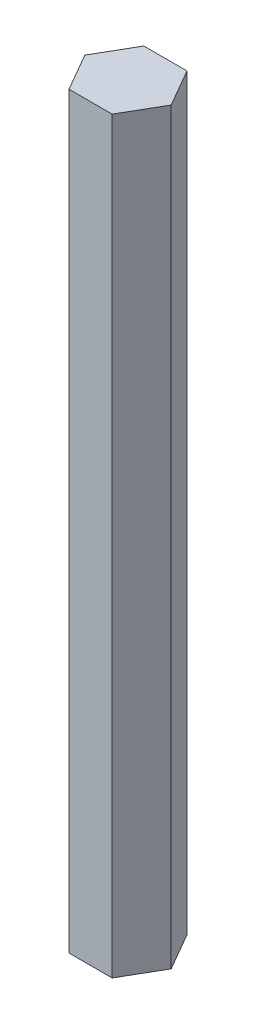
ISO-10303-21;
HEADER;
FILE_DESCRIPTION(('STEP AP214'),'2;1');
FILE_NAME('part.step','',(''),(''),'','','');
FILE_SCHEMA(('AUTOMOTIVE_DESIGN { 1 0 10303 214 1 1 1 1 }'));
ENDSEC;
DATA;
#1=APPLICATION_CONTEXT('core data for automotive mechanical design processes');
#2=APPLICATION_PROTOCOL_DEFINITION('international standard','automotive_design',2000,#1);
#3=PRODUCT_CONTEXT('',#1,'mechanical');
#4=PRODUCT('Part','Part','',(#3));
#5=PRODUCT_RELATED_PRODUCT_CATEGORY('part','',(#4));
#6=PRODUCT_DEFINITION_FORMATION('','',#4);
#7=PRODUCT_DEFINITION_CONTEXT('part definition',#1,'design');
#8=PRODUCT_DEFINITION('design','',#6,#7);
#9=PRODUCT_DEFINITION_SHAPE('','',#8);
#10=(LENGTH_UNIT() NAMED_UNIT(*) SI_UNIT(.MILLI.,.METRE.));
#11=(NAMED_UNIT(*) PLANE_ANGLE_UNIT() SI_UNIT($,.RADIAN.));
#12=(NAMED_UNIT(*) SI_UNIT($,.STERADIAN.) SOLID_ANGLE_UNIT());
#13=UNCERTAINTY_MEASURE_WITH_UNIT(LENGTH_MEASURE(1.E-05),#10,'distance_accuracy_value','');
#14=(GEOMETRIC_REPRESENTATION_CONTEXT(3) GLOBAL_UNCERTAINTY_ASSIGNED_CONTEXT((#13)) GLOBAL_UNIT_ASSIGNED_CONTEXT((#10,
#11,#12)) REPRESENTATION_CONTEXT('',''));
#15=CARTESIAN_POINT('',(0.,0.,0.));
#16=DIRECTION('',(0.,0.,1.));
#17=DIRECTION('',(1.,0.,0.));
#18=AXIS2_PLACEMENT_3D('',#15,#16,#17);
#19=CARTESIAN_POINT('',(3.66617420935418,63.5,6.34999999999993));
#20=DIRECTION('',(-0.866025403784441,0.,-0.499999999999995));
#21=DIRECTION('',(-0.499999999999995,0.,0.866025403784442));
#22=AXIS2_PLACEMENT_3D('',#19,#20,#21);
#23=PLANE('',#22);
#24=DIRECTION('',(0.499999999999995,0.,-0.866025403784441));
#25=VECTOR('',#24,1.);
#26=CARTESIAN_POINT('',(3.66617420935418,-63.5,6.34999999999993));
#27=LINE('',#26,#25);
#28=CARTESIAN_POINT('',(3.66617420935418,-63.5,6.34999999999993));
#29=VERTEX_POINT('',#28);
#30=CARTESIAN_POINT('',(7.33234841870822,-63.5,0.));
#31=VERTEX_POINT('',#30);
#32=EDGE_CURVE('E119',#29,#31,#27,.T.);
#33=ORIENTED_EDGE('',*,*,#32,.T.);
#34=DIRECTION('',(0.,-1.,0.));
#35=VECTOR('',#34,1.);
#36=CARTESIAN_POINT('',(7.33234841870822,63.5,0.));
#37=LINE('',#36,#35);
#38=CARTESIAN_POINT('',(7.33234841870822,63.5,0.));
#39=VERTEX_POINT('',#38);
#40=EDGE_CURVE('E11',#39,#31,#37,.T.);
#41=ORIENTED_EDGE('',*,*,#40,.F.);
#42=DIRECTION('',(0.499999999999995,0.,-0.866025403784441));
#43=VECTOR('',#42,1.);
#44=CARTESIAN_POINT('',(3.66617420935418,63.5,6.34999999999993));
#45=LINE('',#44,#43);
#46=CARTESIAN_POINT('',(3.66617420935418,63.5,6.34999999999993));
#47=VERTEX_POINT('',#46);
#48=EDGE_CURVE('E129',#47,#39,#45,.T.);
#49=ORIENTED_EDGE('',*,*,#48,.F.);
#50=DIRECTION('',(0.,-1.,0.));
#51=VECTOR('',#50,1.);
#52=CARTESIAN_POINT('',(3.66617420935418,63.5,6.34999999999993));
#53=LINE('',#52,#51);
#54=EDGE_CURVE('E115',#47,#29,#53,.T.);
#55=ORIENTED_EDGE('',*,*,#54,.T.);
#56=EDGE_LOOP('',(#33,#41,#49,#55));
#57=FACE_BOUND('',#56,.T.);
#58=ADVANCED_FACE('F35',(#57),#23,.F.);
#59=CARTESIAN_POINT('',(7.33234841870822,63.5,0.));
#60=DIRECTION('',(-0.866025403784438,0.,0.500000000000001));
#61=DIRECTION('',(0.500000000000001,0.,0.866025403784438));
#62=AXIS2_PLACEMENT_3D('',#59,#60,#61);
#63=PLANE('',#62);
#64=DIRECTION('',(-0.500000000000001,0.,-0.866025403784438));
#65=VECTOR('',#64,1.);
#66=CARTESIAN_POINT('',(7.33234841870822,-63.5,0.));
#67=LINE('',#66,#65);
#68=CARTESIAN_POINT('',(3.6661742093541,-63.5,-6.34999999999999));
#69=VERTEX_POINT('',#68);
#70=EDGE_CURVE('E122',#31,#69,#67,.T.);
#71=ORIENTED_EDGE('',*,*,#70,.T.);
#72=DIRECTION('',(0.,-1.,0.));
#73=VECTOR('',#72,1.);
#74=CARTESIAN_POINT('',(3.6661742093541,63.5,-6.34999999999999));
#75=LINE('',#74,#73);
#76=CARTESIAN_POINT('',(3.6661742093541,63.5,-6.34999999999999));
#77=VERTEX_POINT('',#76);
#78=EDGE_CURVE('E43',#77,#69,#75,.T.);
#79=ORIENTED_EDGE('',*,*,#78,.F.);
#80=DIRECTION('',(-0.500000000000001,0.,-0.866025403784438));
#81=VECTOR('',#80,1.);
#82=CARTESIAN_POINT('',(7.33234841870822,63.5,0.));
#83=LINE('',#82,#81);
#84=EDGE_CURVE('E88',#39,#77,#83,.T.);
#85=ORIENTED_EDGE('',*,*,#84,.F.);
#86=ORIENTED_EDGE('',*,*,#40,.T.);
#87=EDGE_LOOP('',(#71,#79,#85,#86));
#88=FACE_BOUND('',#87,.T.);
#89=ADVANCED_FACE('F153',(#88),#63,.F.);
#90=CARTESIAN_POINT('',(3.6661742093541,63.5,-6.34999999999999));
#91=DIRECTION('',(0.,0.,1.));
#92=DIRECTION('',(1.,0.,0.));
#93=AXIS2_PLACEMENT_3D('',#90,#91,#92);
#94=PLANE('',#93);
#95=DIRECTION('',(-1.,0.,0.));
#96=VECTOR('',#95,1.);
#97=CARTESIAN_POINT('',(3.6661742093541,-63.5,-6.34999999999999));
#98=LINE('',#97,#96);
#99=CARTESIAN_POINT('',(-3.66617420935414,-63.5,-6.34999999999996));
#100=VERTEX_POINT('',#99);
#101=EDGE_CURVE('E124',#69,#100,#98,.T.);
#102=ORIENTED_EDGE('',*,*,#101,.T.);
#103=DIRECTION('',(0.,-1.,0.));
#104=VECTOR('',#103,1.);
#105=CARTESIAN_POINT('',(-3.66617420935414,63.5,-6.34999999999996));
#106=LINE('',#105,#104);
#107=CARTESIAN_POINT('',(-3.66617420935414,63.5,-6.34999999999996));
#108=VERTEX_POINT('',#107);
#109=EDGE_CURVE('E110',#108,#100,#106,.T.);
#110=ORIENTED_EDGE('',*,*,#109,.F.);
#111=DIRECTION('',(-1.,0.,0.));
#112=VECTOR('',#111,1.);
#113=CARTESIAN_POINT('',(3.6661742093541,63.5,-6.34999999999999));
#114=LINE('',#113,#112);
#115=EDGE_CURVE('E101',#77,#108,#114,.T.);
#116=ORIENTED_EDGE('',*,*,#115,.F.);
#117=ORIENTED_EDGE('',*,*,#78,.T.);
#118=EDGE_LOOP('',(#102,#110,#116,#117));
#119=FACE_BOUND('',#118,.T.);
#120=ADVANCED_FACE('F135',(#119),#94,.F.);
#121=CARTESIAN_POINT('',(-3.66617420935414,63.5,-6.34999999999996));
#122=DIRECTION('',(0.866025403784442,0.,0.499999999999995));
#123=DIRECTION('',(0.499999999999995,0.,-0.866025403784442));
#124=AXIS2_PLACEMENT_3D('',#121,#122,#123);
#125=PLANE('',#124);
#126=DIRECTION('',(-0.499999999999995,0.,0.866025403784442));
#127=VECTOR('',#126,1.);
#128=CARTESIAN_POINT('',(-3.66617420935414,-63.5,-6.34999999999996));
#129=LINE('',#128,#127);
#130=CARTESIAN_POINT('',(-7.33234841870822,-63.5,0.));
#131=VERTEX_POINT('',#130);
#132=EDGE_CURVE('E109',#100,#131,#129,.T.);
#133=ORIENTED_EDGE('',*,*,#132,.T.);
#134=DIRECTION('',(0.,-1.,0.));
#135=VECTOR('',#134,1.);
#136=CARTESIAN_POINT('',(-7.33234841870822,63.5,0.));
#137=LINE('',#136,#135);
#138=CARTESIAN_POINT('',(-7.33234841870822,63.5,0.));
#139=VERTEX_POINT('',#138);
#140=EDGE_CURVE('E106',#139,#131,#137,.T.);
#141=ORIENTED_EDGE('',*,*,#140,.F.);
#142=DIRECTION('',(-0.499999999999995,0.,0.866025403784442));
#143=VECTOR('',#142,1.);
#144=CARTESIAN_POINT('',(-3.66617420935414,63.5,-6.34999999999996));
#145=LINE('',#144,#143);
#146=EDGE_CURVE('E95',#108,#139,#145,.T.);
#147=ORIENTED_EDGE('',*,*,#146,.F.);
#148=ORIENTED_EDGE('',*,*,#109,.T.);
#149=EDGE_LOOP('',(#133,#141,#147,#148));
#150=FACE_BOUND('',#149,.T.);
#151=ADVANCED_FACE('F107',(#150),#125,.F.);
#152=CARTESIAN_POINT('',(-7.33234841870822,63.5,0.));
#153=DIRECTION('',(0.866025403784435,0.,-0.500000000000007));
#154=DIRECTION('',(-0.500000000000007,0.,-0.866025403784435));
#155=AXIS2_PLACEMENT_3D('',#152,#153,#154);
#156=PLANE('',#155);
#157=DIRECTION('',(0.500000000000007,0.,0.866025403784435));
#158=VECTOR('',#157,1.);
#159=CARTESIAN_POINT('',(-7.33234841870822,-63.5,0.));
#160=LINE('',#159,#158);
#161=CARTESIAN_POINT('',(-3.66617420935405,-63.5,6.35000000000001));
#162=VERTEX_POINT('',#161);
#163=EDGE_CURVE('E74',#131,#162,#160,.T.);
#164=ORIENTED_EDGE('',*,*,#163,.T.);
#165=DIRECTION('',(0.,-1.,0.));
#166=VECTOR('',#165,1.);
#167=CARTESIAN_POINT('',(-3.66617420935405,63.5,6.35000000000001));
#168=LINE('',#167,#166);
#169=CARTESIAN_POINT('',(-3.66617420935405,63.5,6.35000000000001));
#170=VERTEX_POINT('',#169);
#171=EDGE_CURVE('E111',#170,#162,#168,.T.);
#172=ORIENTED_EDGE('',*,*,#171,.F.);
#173=DIRECTION('',(0.500000000000007,0.,0.866025403784435));
#174=VECTOR('',#173,1.);
#175=CARTESIAN_POINT('',(-7.33234841870822,63.5,0.));
#176=LINE('',#175,#174);
#177=EDGE_CURVE('E99',#139,#170,#176,.T.);
#178=ORIENTED_EDGE('',*,*,#177,.F.);
#179=ORIENTED_EDGE('',*,*,#140,.T.);
#180=EDGE_LOOP('',(#164,#172,#178,#179));
#181=FACE_BOUND('',#180,.T.);
#182=ADVANCED_FACE('F113',(#181),#156,.F.);
#183=CARTESIAN_POINT('',(-3.66617420935405,63.5,6.35000000000001));
#184=DIRECTION('',(0.,0.,-1.));
#185=DIRECTION('',(-1.,0.,0.));
#186=AXIS2_PLACEMENT_3D('',#183,#184,#185);
#187=PLANE('',#186);
#188=DIRECTION('',(1.,0.,0.));
#189=VECTOR('',#188,1.);
#190=CARTESIAN_POINT('',(-3.66617420935405,-63.5,6.35000000000001));
#191=LINE('',#190,#189);
#192=EDGE_CURVE('E80',#162,#29,#191,.T.);
#193=ORIENTED_EDGE('',*,*,#192,.T.);
#194=ORIENTED_EDGE('',*,*,#54,.F.);
#195=DIRECTION('',(1.,0.,0.));
#196=VECTOR('',#195,1.);
#197=CARTESIAN_POINT('',(-3.66617420935405,63.5,6.35000000000001));
#198=LINE('',#197,#196);
#199=EDGE_CURVE('E51',#170,#47,#198,.T.);
#200=ORIENTED_EDGE('',*,*,#199,.F.);
#201=ORIENTED_EDGE('',*,*,#171,.T.);
#202=EDGE_LOOP('',(#193,#194,#200,#201));
#203=FACE_BOUND('',#202,.T.);
#204=ADVANCED_FACE('F142',(#203),#187,.F.);
#205=CARTESIAN_POINT('',(0.,63.5,0.));
#206=DIRECTION('',(0.,1.,0.));
#207=DIRECTION('',(0.,0.,1.));
#208=AXIS2_PLACEMENT_3D('',#205,#206,#207);
#209=PLANE('',#208);
#210=ORIENTED_EDGE('',*,*,#48,.T.);
#211=ORIENTED_EDGE('',*,*,#84,.T.);
#212=ORIENTED_EDGE('',*,*,#115,.T.);
#213=ORIENTED_EDGE('',*,*,#146,.T.);
#214=ORIENTED_EDGE('',*,*,#177,.T.);
#215=ORIENTED_EDGE('',*,*,#199,.T.);
#216=EDGE_LOOP('',(#210,#211,#212,#213,#214,#215));
#217=FACE_BOUND('',#216,.T.);
#218=ADVANCED_FACE('F97',(#217),#209,.T.);
#219=CARTESIAN_POINT('',(0.,-63.5,0.));
#220=DIRECTION('',(0.,1.,0.));
#221=DIRECTION('',(0.,0.,1.));
#222=AXIS2_PLACEMENT_3D('',#219,#220,#221);
#223=PLANE('',#222);
#224=ORIENTED_EDGE('',*,*,#32,.F.);
#225=ORIENTED_EDGE('',*,*,#192,.F.);
#226=ORIENTED_EDGE('',*,*,#163,.F.);
#227=ORIENTED_EDGE('',*,*,#132,.F.);
#228=ORIENTED_EDGE('',*,*,#101,.F.);
#229=ORIENTED_EDGE('',*,*,#70,.F.);
#230=EDGE_LOOP('',(#224,#225,#226,#227,#228,#229));
#231=FACE_BOUND('',#230,.T.);
#232=ADVANCED_FACE('F138',(#231),#223,.F.);
#233=CLOSED_SHELL('',(#58,#89,#120,#151,#182,#204,#218,#232));
#234=MANIFOLD_SOLID_BREP('B2',#233);
#235=ADVANCED_BREP_SHAPE_REPRESENTATION('',(#18,#234),#14);
#236=SHAPE_DEFINITION_REPRESENTATION(#9,#235);
ENDSEC;
END-ISO-10303-21;
